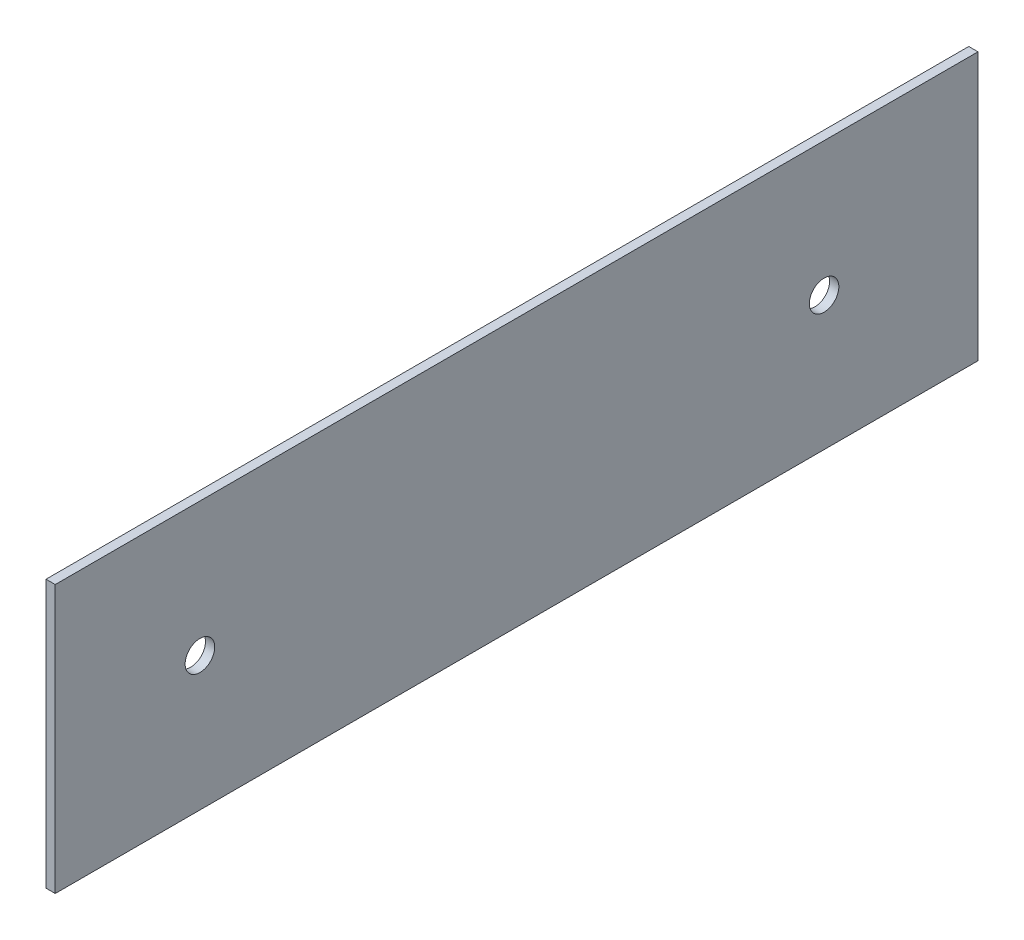
ISO-10303-21;
HEADER;
FILE_DESCRIPTION(('STEP AP214'),'2;1');
FILE_NAME('part.step','',(''),(''),'','','');
FILE_SCHEMA(('AUTOMOTIVE_DESIGN { 1 0 10303 214 1 1 1 1 }'));
ENDSEC;
DATA;
#1=APPLICATION_CONTEXT('core data for automotive mechanical design processes');
#2=APPLICATION_PROTOCOL_DEFINITION('international standard','automotive_design',2000,#1);
#3=PRODUCT_CONTEXT('',#1,'mechanical');
#4=PRODUCT('Part','Part','',(#3));
#5=PRODUCT_RELATED_PRODUCT_CATEGORY('part','',(#4));
#6=PRODUCT_DEFINITION_FORMATION('','',#4);
#7=PRODUCT_DEFINITION_CONTEXT('part definition',#1,'design');
#8=PRODUCT_DEFINITION('design','',#6,#7);
#9=PRODUCT_DEFINITION_SHAPE('','',#8);
#10=(LENGTH_UNIT() NAMED_UNIT(*) SI_UNIT(.MILLI.,.METRE.));
#11=(NAMED_UNIT(*) PLANE_ANGLE_UNIT() SI_UNIT($,.RADIAN.));
#12=(NAMED_UNIT(*) SI_UNIT($,.STERADIAN.) SOLID_ANGLE_UNIT());
#13=UNCERTAINTY_MEASURE_WITH_UNIT(LENGTH_MEASURE(1.E-05),#10,'distance_accuracy_value','');
#14=(GEOMETRIC_REPRESENTATION_CONTEXT(3) GLOBAL_UNCERTAINTY_ASSIGNED_CONTEXT((#13)) GLOBAL_UNIT_ASSIGNED_CONTEXT((#10,
#11,#12)) REPRESENTATION_CONTEXT('',''));
#15=CARTESIAN_POINT('',(0.,0.,0.));
#16=DIRECTION('',(0.,0.,1.));
#17=DIRECTION('',(1.,0.,0.));
#18=AXIS2_PLACEMENT_3D('',#15,#16,#17);
#19=CARTESIAN_POINT('',(5.,84.9999999999999,250.));
#20=DIRECTION('',(0.,0.,-1.));
#21=DIRECTION('',(0.,1.,0.));
#22=AXIS2_PLACEMENT_3D('',#19,#20,#21);
#23=PLANE('',#22);
#24=DIRECTION('',(0.,-1.,0.));
#25=VECTOR('',#24,1.);
#26=CARTESIAN_POINT('',(0.,84.9999999999999,250.));
#27=LINE('',#26,#25);
#28=CARTESIAN_POINT('',(0.,84.9999999999999,250.));
#29=VERTEX_POINT('',#28);
#30=CARTESIAN_POINT('',(0.,-60.0000000000003,250.));
#31=VERTEX_POINT('',#30);
#32=EDGE_CURVE('E97',#29,#31,#27,.T.);
#33=ORIENTED_EDGE('',*,*,#32,.T.);
#34=DIRECTION('',(-1.,0.,0.));
#35=VECTOR('',#34,1.);
#36=CARTESIAN_POINT('',(5.,-60.0000000000003,250.));
#37=LINE('',#36,#35);
#38=CARTESIAN_POINT('',(5.,-60.0000000000003,250.));
#39=VERTEX_POINT('',#38);
#40=EDGE_CURVE('E11',#39,#31,#37,.T.);
#41=ORIENTED_EDGE('',*,*,#40,.F.);
#42=DIRECTION('',(0.,-1.,0.));
#43=VECTOR('',#42,1.);
#44=CARTESIAN_POINT('',(5.,84.9999999999999,250.));
#45=LINE('',#44,#43);
#46=CARTESIAN_POINT('',(5.,84.9999999999999,250.));
#47=VERTEX_POINT('',#46);
#48=EDGE_CURVE('E85',#47,#39,#45,.T.);
#49=ORIENTED_EDGE('',*,*,#48,.F.);
#50=DIRECTION('',(-1.,0.,0.));
#51=VECTOR('',#50,1.);
#52=CARTESIAN_POINT('',(5.,84.9999999999999,250.));
#53=LINE('',#52,#51);
#54=EDGE_CURVE('E93',#47,#29,#53,.T.);
#55=ORIENTED_EDGE('',*,*,#54,.T.);
#56=EDGE_LOOP('',(#33,#41,#49,#55));
#57=FACE_BOUND('',#56,.T.);
#58=ADVANCED_FACE('F34',(#57),#23,.F.);
#59=CARTESIAN_POINT('',(5.,-60.0000000000003,250.));
#60=DIRECTION('',(0.,1.,0.));
#61=DIRECTION('',(0.,0.,1.));
#62=AXIS2_PLACEMENT_3D('',#59,#60,#61);
#63=PLANE('',#62);
#64=DIRECTION('',(0.,0.,-1.));
#65=VECTOR('',#64,1.);
#66=CARTESIAN_POINT('',(0.,-60.0000000000003,250.));
#67=LINE('',#66,#65);
#68=CARTESIAN_POINT('',(0.,-60.0000000000003,-250.));
#69=VERTEX_POINT('',#68);
#70=EDGE_CURVE('E89',#31,#69,#67,.T.);
#71=ORIENTED_EDGE('',*,*,#70,.T.);
#72=DIRECTION('',(-1.,0.,0.));
#73=VECTOR('',#72,1.);
#74=CARTESIAN_POINT('',(5.,-60.0000000000003,-250.));
#75=LINE('',#74,#73);
#76=CARTESIAN_POINT('',(5.,-60.0000000000003,-250.));
#77=VERTEX_POINT('',#76);
#78=EDGE_CURVE('E42',#77,#69,#75,.T.);
#79=ORIENTED_EDGE('',*,*,#78,.F.);
#80=DIRECTION('',(0.,0.,-1.));
#81=VECTOR('',#80,1.);
#82=CARTESIAN_POINT('',(5.,-60.0000000000003,250.));
#83=LINE('',#82,#81);
#84=EDGE_CURVE('E80',#39,#77,#83,.T.);
#85=ORIENTED_EDGE('',*,*,#84,.F.);
#86=ORIENTED_EDGE('',*,*,#40,.T.);
#87=EDGE_LOOP('',(#71,#79,#85,#86));
#88=FACE_BOUND('',#87,.T.);
#89=ADVANCED_FACE('F88',(#88),#63,.F.);
#90=CARTESIAN_POINT('',(5.,84.9999999999997,-250.));
#91=DIRECTION('',(0.,0.,1.));
#92=DIRECTION('',(0.,-1.,0.));
#93=AXIS2_PLACEMENT_3D('',#90,#91,#92);
#94=PLANE('',#93);
#95=DIRECTION('',(0.,1.,0.));
#96=VECTOR('',#95,1.);
#97=CARTESIAN_POINT('',(0.,84.9999999999997,-250.));
#98=LINE('',#97,#96);
#99=CARTESIAN_POINT('',(0.,84.9999999999997,-250.));
#100=VERTEX_POINT('',#99);
#101=EDGE_CURVE('E67',#69,#100,#98,.T.);
#102=ORIENTED_EDGE('',*,*,#101,.T.);
#103=DIRECTION('',(-1.,0.,0.));
#104=VECTOR('',#103,1.);
#105=CARTESIAN_POINT('',(5.,84.9999999999997,-250.));
#106=LINE('',#105,#104);
#107=CARTESIAN_POINT('',(5.,84.9999999999997,-250.));
#108=VERTEX_POINT('',#107);
#109=EDGE_CURVE('E90',#108,#100,#106,.T.);
#110=ORIENTED_EDGE('',*,*,#109,.F.);
#111=DIRECTION('',(0.,1.,0.));
#112=VECTOR('',#111,1.);
#113=CARTESIAN_POINT('',(5.,84.9999999999997,-250.));
#114=LINE('',#113,#112);
#115=EDGE_CURVE('E83',#77,#108,#114,.T.);
#116=ORIENTED_EDGE('',*,*,#115,.F.);
#117=ORIENTED_EDGE('',*,*,#78,.T.);
#118=EDGE_LOOP('',(#102,#110,#116,#117));
#119=FACE_BOUND('',#118,.T.);
#120=ADVANCED_FACE('F91',(#119),#94,.F.);
#121=CARTESIAN_POINT('',(5.,84.9999999999999,250.));
#122=DIRECTION('',(0.,-1.,0.));
#123=DIRECTION('',(0.,0.,-1.));
#124=AXIS2_PLACEMENT_3D('',#121,#122,#123);
#125=PLANE('',#124);
#126=DIRECTION('',(0.,0.,1.));
#127=VECTOR('',#126,1.);
#128=CARTESIAN_POINT('',(0.,84.9999999999999,250.));
#129=LINE('',#128,#127);
#130=EDGE_CURVE('E73',#100,#29,#129,.T.);
#131=ORIENTED_EDGE('',*,*,#130,.T.);
#132=ORIENTED_EDGE('',*,*,#54,.F.);
#133=DIRECTION('',(0.,0.,1.));
#134=VECTOR('',#133,1.);
#135=CARTESIAN_POINT('',(5.,84.9999999999999,250.));
#136=LINE('',#135,#134);
#137=EDGE_CURVE('E50',#108,#47,#136,.T.);
#138=ORIENTED_EDGE('',*,*,#137,.F.);
#139=ORIENTED_EDGE('',*,*,#109,.T.);
#140=EDGE_LOOP('',(#131,#132,#138,#139));
#141=FACE_BOUND('',#140,.T.);
#142=ADVANCED_FACE('F105',(#141),#125,.F.);
#143=CARTESIAN_POINT('',(5.,0.,0.));
#144=DIRECTION('',(1.,0.,0.));
#145=DIRECTION('',(0.,0.,-1.));
#146=AXIS2_PLACEMENT_3D('',#143,#144,#145);
#147=PLANE('',#146);
#148=CARTESIAN_POINT('',(5.,12.4999999999998,-166.600500868498));
#149=DIRECTION('',(1.,0.,0.));
#150=DIRECTION('',(0.,0.,-1.));
#151=AXIS2_PLACEMENT_3D('',#148,#149,#150);
#152=CIRCLE('',#151,8.00000000000001);
#153=CARTESIAN_POINT('',(5.,12.4999999999998,-174.600500868498));
#154=VERTEX_POINT('',#153);
#155=EDGE_CURVE('E114',#154,#154,#152,.T.);
#156=ORIENTED_EDGE('',*,*,#155,.F.);
#157=EDGE_LOOP('',(#156));
#158=FACE_BOUND('',#157,.T.);
#159=CARTESIAN_POINT('',(5.,12.4999999999998,171.600500868498));
#160=DIRECTION('',(1.,0.,0.));
#161=DIRECTION('',(0.,0.,-1.));
#162=AXIS2_PLACEMENT_3D('',#159,#160,#161);
#163=CIRCLE('',#162,8.00000000000001);
#164=CARTESIAN_POINT('',(5.,12.4999999999998,163.600500868498));
#165=VERTEX_POINT('',#164);
#166=EDGE_CURVE('E111',#165,#165,#163,.F.);
#167=ORIENTED_EDGE('',*,*,#166,.T.);
#168=EDGE_LOOP('',(#167));
#169=FACE_BOUND('',#168,.T.);
#170=ORIENTED_EDGE('',*,*,#48,.T.);
#171=ORIENTED_EDGE('',*,*,#84,.T.);
#172=ORIENTED_EDGE('',*,*,#115,.T.);
#173=ORIENTED_EDGE('',*,*,#137,.T.);
#174=EDGE_LOOP('',(#170,#171,#172,#173));
#175=FACE_BOUND('',#174,.T.);
#176=ADVANCED_FACE('F81',(#158,#169,#175),#147,.T.);
#177=CARTESIAN_POINT('',(0.,0.,0.));
#178=DIRECTION('',(1.,0.,0.));
#179=DIRECTION('',(0.,0.,-1.));
#180=AXIS2_PLACEMENT_3D('',#177,#178,#179);
#181=PLANE('',#180);
#182=CARTESIAN_POINT('',(0.,12.4999999999998,-166.600500868498));
#183=DIRECTION('',(1.,0.,0.));
#184=DIRECTION('',(0.,0.,-1.));
#185=AXIS2_PLACEMENT_3D('',#182,#183,#184);
#186=CIRCLE('',#185,8.00000000000001);
#187=CARTESIAN_POINT('',(0.,12.4999999999998,-174.600500868498));
#188=VERTEX_POINT('',#187);
#189=EDGE_CURVE('E119',#188,#188,#186,.T.);
#190=ORIENTED_EDGE('',*,*,#189,.T.);
#191=EDGE_LOOP('',(#190));
#192=FACE_BOUND('',#191,.T.);
#193=CARTESIAN_POINT('',(0.,12.4999999999998,171.600500868498));
#194=DIRECTION('',(-1.,0.,0.));
#195=DIRECTION('',(0.,0.,1.));
#196=AXIS2_PLACEMENT_3D('',#193,#194,#195);
#197=CIRCLE('',#196,8.00000000000001);
#198=CARTESIAN_POINT('',(0.,12.4999999999998,179.600500868498));
#199=VERTEX_POINT('',#198);
#200=EDGE_CURVE('E100',#199,#199,#197,.T.);
#201=ORIENTED_EDGE('',*,*,#200,.F.);
#202=EDGE_LOOP('',(#201));
#203=FACE_BOUND('',#202,.T.);
#204=ORIENTED_EDGE('',*,*,#32,.F.);
#205=ORIENTED_EDGE('',*,*,#130,.F.);
#206=ORIENTED_EDGE('',*,*,#101,.F.);
#207=ORIENTED_EDGE('',*,*,#70,.F.);
#208=EDGE_LOOP('',(#204,#205,#206,#207));
#209=FACE_BOUND('',#208,.T.);
#210=ADVANCED_FACE('F108',(#192,#203,#209),#181,.F.);
#211=CARTESIAN_POINT('',(5.001,12.4999999999998,171.600500868498));
#212=DIRECTION('',(-1.,0.,0.));
#213=DIRECTION('',(0.,0.,1.));
#214=AXIS2_PLACEMENT_3D('',#211,#212,#213);
#215=CYLINDRICAL_SURFACE('',#214,8.00000000000001);
#216=ORIENTED_EDGE('',*,*,#166,.F.);
#217=EDGE_LOOP('',(#216));
#218=FACE_BOUND('',#217,.T.);
#219=ORIENTED_EDGE('',*,*,#200,.T.);
#220=EDGE_LOOP('',(#219));
#221=FACE_BOUND('',#220,.T.);
#222=ADVANCED_FACE('F127',(#218,#221),#215,.F.);
#223=CARTESIAN_POINT('',(5.001,12.4999999999998,-166.600500868498));
#224=DIRECTION('',(-1.,0.,0.));
#225=DIRECTION('',(0.,0.,1.));
#226=AXIS2_PLACEMENT_3D('',#223,#224,#225);
#227=CYLINDRICAL_SURFACE('',#226,8.00000000000001);
#228=ORIENTED_EDGE('',*,*,#155,.T.);
#229=EDGE_LOOP('',(#228));
#230=FACE_BOUND('',#229,.T.);
#231=ORIENTED_EDGE('',*,*,#189,.F.);
#232=EDGE_LOOP('',(#231));
#233=FACE_BOUND('',#232,.T.);
#234=ADVANCED_FACE('F125',(#230,#233),#227,.F.);
#235=CLOSED_SHELL('',(#58,#89,#120,#142,#176,#210,#222,#234));
#236=MANIFOLD_SOLID_BREP('B2',#235);
#237=ADVANCED_BREP_SHAPE_REPRESENTATION('',(#18,#236),#14);
#238=SHAPE_DEFINITION_REPRESENTATION(#9,#237);
ENDSEC;
END-ISO-10303-21;
